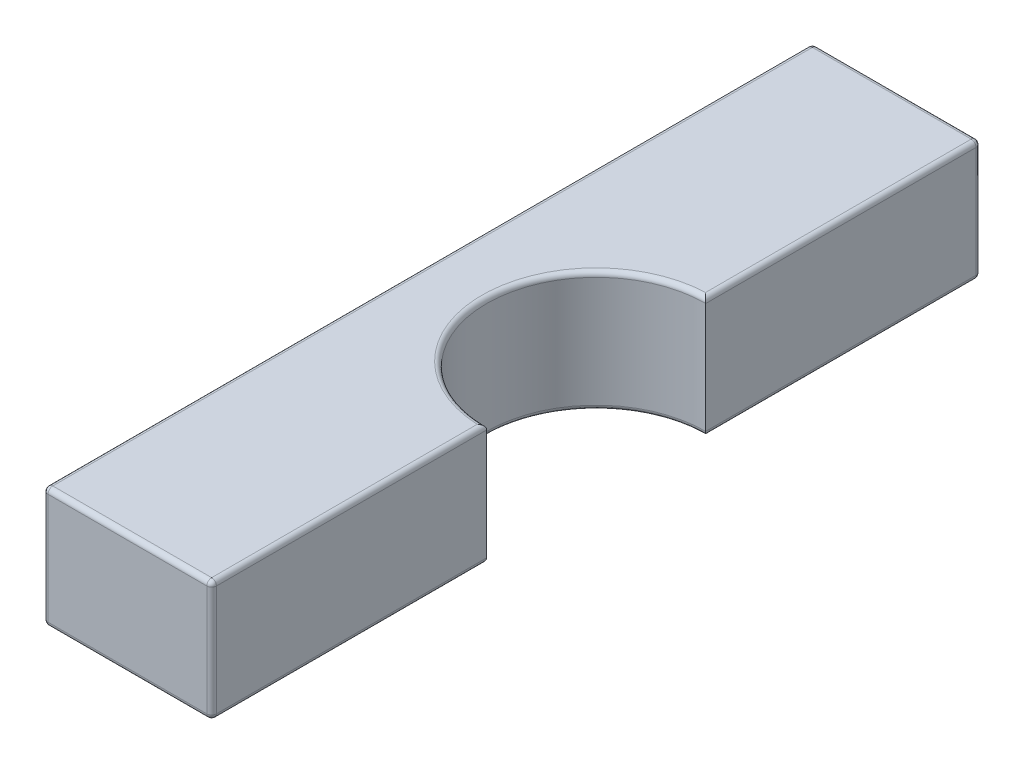
ISO-10303-21;
HEADER;
FILE_DESCRIPTION(('STEP AP214'),'2;1');
FILE_NAME('part.step','',(''),(''),'','','');
FILE_SCHEMA(('AUTOMOTIVE_DESIGN { 1 0 10303 214 1 1 1 1 }'));
ENDSEC;
DATA;
#1=APPLICATION_CONTEXT('core data for automotive mechanical design processes');
#2=APPLICATION_PROTOCOL_DEFINITION('international standard','automotive_design',2000,#1);
#3=PRODUCT_CONTEXT('',#1,'mechanical');
#4=PRODUCT('Part','Part','',(#3));
#5=PRODUCT_RELATED_PRODUCT_CATEGORY('part','',(#4));
#6=PRODUCT_DEFINITION_FORMATION('','',#4);
#7=PRODUCT_DEFINITION_CONTEXT('part definition',#1,'design');
#8=PRODUCT_DEFINITION('design','',#6,#7);
#9=PRODUCT_DEFINITION_SHAPE('','',#8);
#10=(LENGTH_UNIT() NAMED_UNIT(*) SI_UNIT(.MILLI.,.METRE.));
#11=(NAMED_UNIT(*) PLANE_ANGLE_UNIT() SI_UNIT($,.RADIAN.));
#12=(NAMED_UNIT(*) SI_UNIT($,.STERADIAN.) SOLID_ANGLE_UNIT());
#13=UNCERTAINTY_MEASURE_WITH_UNIT(LENGTH_MEASURE(1.E-05),#10,'distance_accuracy_value','');
#14=(GEOMETRIC_REPRESENTATION_CONTEXT(3) GLOBAL_UNCERTAINTY_ASSIGNED_CONTEXT((#13)) GLOBAL_UNIT_ASSIGNED_CONTEXT((#10,
#11,#12)) REPRESENTATION_CONTEXT('',''));
#15=CARTESIAN_POINT('',(0.,0.,0.));
#16=DIRECTION('',(0.,0.,1.));
#17=DIRECTION('',(1.,0.,0.));
#18=AXIS2_PLACEMENT_3D('',#15,#16,#17);
#19=CARTESIAN_POINT('',(1.55,0.25,1.598));
#20=DIRECTION('',(0.,-1.,0.));
#21=DIRECTION('',(0.,0.,-1.));
#22=AXIS2_PLACEMENT_3D('',#19,#20,#21);
#23=PLANE('',#22);
#24=DIRECTION('',(1.,0.,0.));
#25=VECTOR('',#24,1.);
#26=CARTESIAN_POINT('',(1.55,0.25,1.578));
#27=LINE('',#26,#25);
#28=CARTESIAN_POINT('',(1.57,0.25,1.578));
#29=VERTEX_POINT('',#28);
#30=CARTESIAN_POINT('',(2.23,0.25,1.578));
#31=VERTEX_POINT('',#30);
#32=EDGE_CURVE('E11',#29,#31,#27,.T.);
#33=ORIENTED_EDGE('',*,*,#32,.T.);
#34=DIRECTION('',(0.,0.,-1.));
#35=VECTOR('',#34,1.);
#36=CARTESIAN_POINT('',(2.23,0.25,1.598));
#37=LINE('',#36,#35);
#38=CARTESIAN_POINT('',(2.23,0.25,0.474578760586691));
#39=VERTEX_POINT('',#38);
#40=EDGE_CURVE('E24',#31,#39,#37,.T.);
#41=ORIENTED_EDGE('',*,*,#40,.T.);
#42=CARTESIAN_POINT('',(2.25,0.25,0.));
#43=DIRECTION('',(0.,-1.,0.));
#44=DIRECTION('',(0.,0.,-1.));
#45=AXIS2_PLACEMENT_3D('',#42,#43,#44);
#46=CIRCLE('',#45,0.475);
#47=CARTESIAN_POINT('',(2.23,0.25,-0.474578760586691));
#48=VERTEX_POINT('',#47);
#49=EDGE_CURVE('E295',#39,#48,#46,.T.);
#50=ORIENTED_EDGE('',*,*,#49,.T.);
#51=DIRECTION('',(0.,0.,-1.));
#52=VECTOR('',#51,1.);
#53=CARTESIAN_POINT('',(2.23,0.25,1.598));
#54=LINE('',#53,#52);
#55=CARTESIAN_POINT('',(2.23,0.25,-1.578));
#56=VERTEX_POINT('',#55);
#57=EDGE_CURVE('E293',#48,#56,#54,.T.);
#58=ORIENTED_EDGE('',*,*,#57,.T.);
#59=DIRECTION('',(-1.,0.,0.));
#60=VECTOR('',#59,1.);
#61=CARTESIAN_POINT('',(1.55,0.25,-1.578));
#62=LINE('',#61,#60);
#63=CARTESIAN_POINT('',(1.57,0.25,-1.578));
#64=VERTEX_POINT('',#63);
#65=EDGE_CURVE('E153',#56,#64,#62,.T.);
#66=ORIENTED_EDGE('',*,*,#65,.T.);
#67=DIRECTION('',(0.,0.,1.));
#68=VECTOR('',#67,1.);
#69=CARTESIAN_POINT('',(1.57,0.25,1.598));
#70=LINE('',#69,#68);
#71=EDGE_CURVE('E290',#64,#29,#70,.T.);
#72=ORIENTED_EDGE('',*,*,#71,.T.);
#73=EDGE_LOOP('',(#33,#41,#50,#58,#66,#72));
#74=FACE_BOUND('',#73,.T.);
#75=ADVANCED_FACE('F17',(#74),#23,.F.);
#76=CARTESIAN_POINT('',(2.25,-0.25,1.598));
#77=DIRECTION('',(0.,1.,0.));
#78=DIRECTION('',(0.,0.,1.));
#79=AXIS2_PLACEMENT_3D('',#76,#77,#78);
#80=PLANE('',#79);
#81=CARTESIAN_POINT('',(2.25,-0.25,0.));
#82=DIRECTION('',(0.,1.,0.));
#83=DIRECTION('',(0.,0.,1.));
#84=AXIS2_PLACEMENT_3D('',#81,#82,#83);
#85=CIRCLE('',#84,0.475);
#86=CARTESIAN_POINT('',(2.23,-0.25,-0.474578760586691));
#87=VERTEX_POINT('',#86);
#88=CARTESIAN_POINT('',(2.23,-0.25,0.474578760586691));
#89=VERTEX_POINT('',#88);
#90=EDGE_CURVE('E288',#87,#89,#85,.T.);
#91=ORIENTED_EDGE('',*,*,#90,.T.);
#92=DIRECTION('',(0.,0.,1.));
#93=VECTOR('',#92,1.);
#94=CARTESIAN_POINT('',(2.23,-0.25,1.598));
#95=LINE('',#94,#93);
#96=CARTESIAN_POINT('',(2.23,-0.25,1.578));
#97=VERTEX_POINT('',#96);
#98=EDGE_CURVE('E286',#89,#97,#95,.T.);
#99=ORIENTED_EDGE('',*,*,#98,.T.);
#100=DIRECTION('',(-1.,0.,0.));
#101=VECTOR('',#100,1.);
#102=CARTESIAN_POINT('',(2.25,-0.25,1.578));
#103=LINE('',#102,#101);
#104=CARTESIAN_POINT('',(1.57,-0.25,1.578));
#105=VERTEX_POINT('',#104);
#106=EDGE_CURVE('E284',#97,#105,#103,.T.);
#107=ORIENTED_EDGE('',*,*,#106,.T.);
#108=DIRECTION('',(0.,0.,-1.));
#109=VECTOR('',#108,1.);
#110=CARTESIAN_POINT('',(1.57,-0.25,1.598));
#111=LINE('',#110,#109);
#112=CARTESIAN_POINT('',(1.57,-0.25,-1.578));
#113=VERTEX_POINT('',#112);
#114=EDGE_CURVE('E282',#105,#113,#111,.T.);
#115=ORIENTED_EDGE('',*,*,#114,.T.);
#116=DIRECTION('',(1.,0.,0.));
#117=VECTOR('',#116,1.);
#118=CARTESIAN_POINT('',(2.25,-0.25,-1.578));
#119=LINE('',#118,#117);
#120=CARTESIAN_POINT('',(2.23,-0.25,-1.578));
#121=VERTEX_POINT('',#120);
#122=EDGE_CURVE('E280',#113,#121,#119,.T.);
#123=ORIENTED_EDGE('',*,*,#122,.T.);
#124=DIRECTION('',(0.,0.,1.));
#125=VECTOR('',#124,1.);
#126=CARTESIAN_POINT('',(2.23,-0.25,1.598));
#127=LINE('',#126,#125);
#128=EDGE_CURVE('E277',#121,#87,#127,.T.);
#129=ORIENTED_EDGE('',*,*,#128,.T.);
#130=EDGE_LOOP('',(#91,#99,#107,#115,#123,#129));
#131=FACE_BOUND('',#130,.T.);
#132=ADVANCED_FACE('F414',(#131),#80,.F.);
#133=CARTESIAN_POINT('',(2.25,0.25,1.598));
#134=DIRECTION('',(-1.,0.,0.));
#135=DIRECTION('',(0.,0.,1.));
#136=AXIS2_PLACEMENT_3D('',#133,#134,#135);
#137=PLANE('',#136);
#138=DIRECTION('',(0.,1.,0.));
#139=VECTOR('',#138,1.);
#140=CARTESIAN_POINT('',(2.25,1.,-0.455));
#141=LINE('',#140,#139);
#142=CARTESIAN_POINT('',(2.25,-0.23,-0.455));
#143=VERTEX_POINT('',#142);
#144=CARTESIAN_POINT('',(2.25,0.23,-0.455));
#145=VERTEX_POINT('',#144);
#146=EDGE_CURVE('E275',#143,#145,#141,.T.);
#147=ORIENTED_EDGE('',*,*,#146,.F.);
#148=DIRECTION('',(0.,0.,-1.));
#149=VECTOR('',#148,1.);
#150=CARTESIAN_POINT('',(2.25,-0.23,1.598));
#151=LINE('',#150,#149);
#152=CARTESIAN_POINT('',(2.25,-0.23,-1.578));
#153=VERTEX_POINT('',#152);
#154=EDGE_CURVE('E273',#143,#153,#151,.T.);
#155=ORIENTED_EDGE('',*,*,#154,.T.);
#156=DIRECTION('',(0.,1.,0.));
#157=VECTOR('',#156,1.);
#158=CARTESIAN_POINT('',(2.25,0.25,-1.578));
#159=LINE('',#158,#157);
#160=CARTESIAN_POINT('',(2.25,0.23,-1.578));
#161=VERTEX_POINT('',#160);
#162=EDGE_CURVE('E271',#153,#161,#159,.T.);
#163=ORIENTED_EDGE('',*,*,#162,.T.);
#164=DIRECTION('',(0.,0.,1.));
#165=VECTOR('',#164,1.);
#166=CARTESIAN_POINT('',(2.25,0.23,1.598));
#167=LINE('',#166,#165);
#168=EDGE_CURVE('E268',#161,#145,#167,.T.);
#169=ORIENTED_EDGE('',*,*,#168,.T.);
#170=EDGE_LOOP('',(#147,#155,#163,#169));
#171=FACE_BOUND('',#170,.T.);
#172=ADVANCED_FACE('F418',(#171),#137,.F.);
#173=CARTESIAN_POINT('',(2.25,0.25,1.598));
#174=DIRECTION('',(-1.,0.,0.));
#175=DIRECTION('',(0.,0.,1.));
#176=AXIS2_PLACEMENT_3D('',#173,#174,#175);
#177=PLANE('',#176);
#178=DIRECTION('',(0.,-1.,0.));
#179=VECTOR('',#178,1.);
#180=CARTESIAN_POINT('',(2.25,0.25,1.578));
#181=LINE('',#180,#179);
#182=CARTESIAN_POINT('',(2.25,0.23,1.578));
#183=VERTEX_POINT('',#182);
#184=CARTESIAN_POINT('',(2.25,-0.23,1.578));
#185=VERTEX_POINT('',#184);
#186=EDGE_CURVE('E266',#183,#185,#181,.T.);
#187=ORIENTED_EDGE('',*,*,#186,.T.);
#188=DIRECTION('',(0.,0.,-1.));
#189=VECTOR('',#188,1.);
#190=CARTESIAN_POINT('',(2.25,-0.23,1.598));
#191=LINE('',#190,#189);
#192=CARTESIAN_POINT('',(2.25,-0.23,0.455));
#193=VERTEX_POINT('',#192);
#194=EDGE_CURVE('E264',#185,#193,#191,.T.);
#195=ORIENTED_EDGE('',*,*,#194,.T.);
#196=DIRECTION('',(0.,-1.,0.));
#197=VECTOR('',#196,1.);
#198=CARTESIAN_POINT('',(2.25,1.,0.455));
#199=LINE('',#198,#197);
#200=CARTESIAN_POINT('',(2.25,0.23,0.455));
#201=VERTEX_POINT('',#200);
#202=EDGE_CURVE('E261',#201,#193,#199,.T.);
#203=ORIENTED_EDGE('',*,*,#202,.F.);
#204=DIRECTION('',(0.,0.,1.));
#205=VECTOR('',#204,1.);
#206=CARTESIAN_POINT('',(2.25,0.23,1.598));
#207=LINE('',#206,#205);
#208=EDGE_CURVE('E258',#201,#183,#207,.T.);
#209=ORIENTED_EDGE('',*,*,#208,.T.);
#210=EDGE_LOOP('',(#187,#195,#203,#209));
#211=FACE_BOUND('',#210,.T.);
#212=ADVANCED_FACE('F352',(#211),#177,.F.);
#213=CARTESIAN_POINT('',(1.55,-0.25,1.598));
#214=DIRECTION('',(1.,0.,0.));
#215=DIRECTION('',(0.,0.,-1.));
#216=AXIS2_PLACEMENT_3D('',#213,#214,#215);
#217=PLANE('',#216);
#218=DIRECTION('',(0.,-1.,0.));
#219=VECTOR('',#218,1.);
#220=CARTESIAN_POINT('',(1.55,-0.25,-1.578));
#221=LINE('',#220,#219);
#222=CARTESIAN_POINT('',(1.55,0.23,-1.578));
#223=VERTEX_POINT('',#222);
#224=CARTESIAN_POINT('',(1.55,-0.23,-1.578));
#225=VERTEX_POINT('',#224);
#226=EDGE_CURVE('E256',#223,#225,#221,.T.);
#227=ORIENTED_EDGE('',*,*,#226,.T.);
#228=DIRECTION('',(0.,0.,1.));
#229=VECTOR('',#228,1.);
#230=CARTESIAN_POINT('',(1.55,-0.23,1.598));
#231=LINE('',#230,#229);
#232=CARTESIAN_POINT('',(1.55,-0.23,1.578));
#233=VERTEX_POINT('',#232);
#234=EDGE_CURVE('E254',#225,#233,#231,.T.);
#235=ORIENTED_EDGE('',*,*,#234,.T.);
#236=DIRECTION('',(0.,1.,0.));
#237=VECTOR('',#236,1.);
#238=CARTESIAN_POINT('',(1.55,-0.25,1.578));
#239=LINE('',#238,#237);
#240=CARTESIAN_POINT('',(1.55,0.23,1.578));
#241=VERTEX_POINT('',#240);
#242=EDGE_CURVE('E252',#233,#241,#239,.T.);
#243=ORIENTED_EDGE('',*,*,#242,.T.);
#244=DIRECTION('',(0.,0.,-1.));
#245=VECTOR('',#244,1.);
#246=CARTESIAN_POINT('',(1.55,0.23,1.598));
#247=LINE('',#246,#245);
#248=EDGE_CURVE('E249',#241,#223,#247,.T.);
#249=ORIENTED_EDGE('',*,*,#248,.T.);
#250=EDGE_LOOP('',(#227,#235,#243,#249));
#251=FACE_BOUND('',#250,.T.);
#252=ADVANCED_FACE('F331',(#251),#217,.F.);
#253=CARTESIAN_POINT('',(2.25,0.25,1.598));
#254=DIRECTION('',(0.,0.,-1.));
#255=DIRECTION('',(-1.,0.,0.));
#256=AXIS2_PLACEMENT_3D('',#253,#254,#255);
#257=PLANE('',#256);
#258=DIRECTION('',(1.,0.,0.));
#259=VECTOR('',#258,1.);
#260=CARTESIAN_POINT('',(2.25,-0.23,1.598));
#261=LINE('',#260,#259);
#262=CARTESIAN_POINT('',(1.57,-0.23,1.598));
#263=VERTEX_POINT('',#262);
#264=CARTESIAN_POINT('',(2.23,-0.23,1.598));
#265=VERTEX_POINT('',#264);
#266=EDGE_CURVE('E247',#263,#265,#261,.T.);
#267=ORIENTED_EDGE('',*,*,#266,.T.);
#268=DIRECTION('',(0.,1.,0.));
#269=VECTOR('',#268,1.);
#270=CARTESIAN_POINT('',(2.23,0.25,1.598));
#271=LINE('',#270,#269);
#272=CARTESIAN_POINT('',(2.23,0.23,1.598));
#273=VERTEX_POINT('',#272);
#274=EDGE_CURVE('E245',#265,#273,#271,.T.);
#275=ORIENTED_EDGE('',*,*,#274,.T.);
#276=DIRECTION('',(-1.,0.,0.));
#277=VECTOR('',#276,1.);
#278=CARTESIAN_POINT('',(2.25,0.23,1.598));
#279=LINE('',#278,#277);
#280=CARTESIAN_POINT('',(1.57,0.23,1.598));
#281=VERTEX_POINT('',#280);
#282=EDGE_CURVE('E243',#273,#281,#279,.T.);
#283=ORIENTED_EDGE('',*,*,#282,.T.);
#284=DIRECTION('',(0.,-1.,0.));
#285=VECTOR('',#284,1.);
#286=CARTESIAN_POINT('',(1.57,0.25,1.598));
#287=LINE('',#286,#285);
#288=EDGE_CURVE('E240',#281,#263,#287,.T.);
#289=ORIENTED_EDGE('',*,*,#288,.T.);
#290=EDGE_LOOP('',(#267,#275,#283,#289));
#291=FACE_BOUND('',#290,.T.);
#292=ADVANCED_FACE('F403',(#291),#257,.F.);
#293=CARTESIAN_POINT('',(2.25,0.25,-1.598));
#294=DIRECTION('',(0.,0.,-1.));
#295=DIRECTION('',(-1.,0.,0.));
#296=AXIS2_PLACEMENT_3D('',#293,#294,#295);
#297=PLANE('',#296);
#298=DIRECTION('',(-1.,0.,0.));
#299=VECTOR('',#298,1.);
#300=CARTESIAN_POINT('',(1.55,-0.23,-1.598));
#301=LINE('',#300,#299);
#302=CARTESIAN_POINT('',(2.23,-0.23,-1.598));
#303=VERTEX_POINT('',#302);
#304=CARTESIAN_POINT('',(1.57,-0.23,-1.598));
#305=VERTEX_POINT('',#304);
#306=EDGE_CURVE('E238',#303,#305,#301,.T.);
#307=ORIENTED_EDGE('',*,*,#306,.T.);
#308=DIRECTION('',(0.,1.,0.));
#309=VECTOR('',#308,1.);
#310=CARTESIAN_POINT('',(1.57,0.25,-1.598));
#311=LINE('',#310,#309);
#312=CARTESIAN_POINT('',(1.57,0.23,-1.598));
#313=VERTEX_POINT('',#312);
#314=EDGE_CURVE('E132',#305,#313,#311,.T.);
#315=ORIENTED_EDGE('',*,*,#314,.T.);
#316=DIRECTION('',(1.,0.,0.));
#317=VECTOR('',#316,1.);
#318=CARTESIAN_POINT('',(2.25,0.23,-1.598));
#319=LINE('',#318,#317);
#320=CARTESIAN_POINT('',(2.23,0.23,-1.598));
#321=VERTEX_POINT('',#320);
#322=EDGE_CURVE('E126',#313,#321,#319,.T.);
#323=ORIENTED_EDGE('',*,*,#322,.T.);
#324=DIRECTION('',(0.,-1.,0.));
#325=VECTOR('',#324,1.);
#326=CARTESIAN_POINT('',(2.23,-0.25,-1.598));
#327=LINE('',#326,#325);
#328=EDGE_CURVE('E129',#321,#303,#327,.T.);
#329=ORIENTED_EDGE('',*,*,#328,.T.);
#330=EDGE_LOOP('',(#307,#315,#323,#329));
#331=FACE_BOUND('',#330,.T.);
#332=ADVANCED_FACE('F128',(#331),#297,.T.);
#333=CARTESIAN_POINT('',(2.25,1.,0.));
#334=DIRECTION('',(0.,-1.,0.));
#335=DIRECTION('',(0.,0.,-1.));
#336=AXIS2_PLACEMENT_3D('',#333,#334,#335);
#337=CYLINDRICAL_SURFACE('',#336,0.455);
#338=ORIENTED_EDGE('',*,*,#202,.T.);
#339=CARTESIAN_POINT('',(2.25,-0.23,0.));
#340=DIRECTION('',(0.,-1.,0.));
#341=DIRECTION('',(0.,0.,1.));
#342=AXIS2_PLACEMENT_3D('',#339,#340,#341);
#343=CIRCLE('',#342,0.455);
#344=EDGE_CURVE('E147',#193,#143,#343,.T.);
#345=ORIENTED_EDGE('',*,*,#344,.T.);
#346=ORIENTED_EDGE('',*,*,#146,.T.);
#347=CARTESIAN_POINT('',(2.25,0.23,0.));
#348=DIRECTION('',(0.,1.,0.));
#349=DIRECTION('',(0.,0.,-1.));
#350=AXIS2_PLACEMENT_3D('',#347,#348,#349);
#351=CIRCLE('',#350,0.455);
#352=EDGE_CURVE('E232',#145,#201,#351,.T.);
#353=ORIENTED_EDGE('',*,*,#352,.T.);
#354=EDGE_LOOP('',(#338,#345,#346,#353));
#355=FACE_BOUND('',#354,.T.);
#356=ADVANCED_FACE('F310',(#355),#337,.F.);
#357=CARTESIAN_POINT('',(1.57,0.23,1.578));
#358=DIRECTION('',(0.,1.,0.));
#359=DIRECTION('',(1.,0.,0.));
#360=AXIS2_PLACEMENT_3D('',#357,#358,#359);
#361=SPHERICAL_SURFACE('',#360,0.02);
#362=CARTESIAN_POINT('',(1.57,0.23,1.578));
#363=DIRECTION('',(0.,-1.,0.));
#364=DIRECTION('',(0.,0.,1.));
#365=AXIS2_PLACEMENT_3D('',#362,#363,#364);
#366=CIRCLE('',#365,0.0200000000000001);
#367=EDGE_CURVE('E229',#281,#241,#366,.T.);
#368=ORIENTED_EDGE('',*,*,#367,.F.);
#369=CARTESIAN_POINT('',(1.57,0.23,1.578));
#370=DIRECTION('',(1.,0.,0.));
#371=DIRECTION('',(0.,0.,1.));
#372=AXIS2_PLACEMENT_3D('',#369,#370,#371);
#373=CIRCLE('',#372,0.0200000000000001);
#374=EDGE_CURVE('E227',#29,#281,#373,.T.);
#375=ORIENTED_EDGE('',*,*,#374,.F.);
#376=CARTESIAN_POINT('',(1.57,0.23,1.578));
#377=DIRECTION('',(0.,0.,-1.));
#378=DIRECTION('',(1.,0.,0.));
#379=AXIS2_PLACEMENT_3D('',#376,#377,#378);
#380=CIRCLE('',#379,0.0200000000000001);
#381=EDGE_CURVE('E224',#241,#29,#380,.T.);
#382=ORIENTED_EDGE('',*,*,#381,.F.);
#383=EDGE_LOOP('',(#368,#375,#382));
#384=FACE_BOUND('',#383,.T.);
#385=ADVANCED_FACE('F339',(#384),#361,.T.);
#386=CARTESIAN_POINT('',(2.25,0.23,1.578));
#387=DIRECTION('',(-1.,0.,0.));
#388=DIRECTION('',(0.,0.,1.));
#389=AXIS2_PLACEMENT_3D('',#386,#387,#388);
#390=CYLINDRICAL_SURFACE('',#389,0.0200000000000001);
#391=ORIENTED_EDGE('',*,*,#374,.T.);
#392=ORIENTED_EDGE('',*,*,#282,.F.);
#393=CARTESIAN_POINT('',(2.23,0.23,1.578));
#394=DIRECTION('',(1.,0.,0.));
#395=DIRECTION('',(0.,0.,-1.));
#396=AXIS2_PLACEMENT_3D('',#393,#394,#395);
#397=CIRCLE('',#396,0.0200000000000001);
#398=EDGE_CURVE('E218',#31,#273,#397,.T.);
#399=ORIENTED_EDGE('',*,*,#398,.F.);
#400=ORIENTED_EDGE('',*,*,#32,.F.);
#401=EDGE_LOOP('',(#391,#392,#399,#400));
#402=FACE_BOUND('',#401,.T.);
#403=ADVANCED_FACE('F341',(#402),#390,.T.);
#404=CARTESIAN_POINT('',(2.23,0.23,1.598));
#405=DIRECTION('',(0.,0.,-1.));
#406=DIRECTION('',(-1.,0.,0.));
#407=AXIS2_PLACEMENT_3D('',#404,#405,#406);
#408=CYLINDRICAL_SURFACE('',#407,0.0200000000000001);
#409=CARTESIAN_POINT('',(2.23,0.25,0.474578760586691));
#410=CARTESIAN_POINT('',(2.23021525393263,0.25,0.474372252404169));
#411=CARTESIAN_POINT('',(2.23043059007006,0.249996522900328,0.474165800682688));
#412=CARTESIAN_POINT('',(2.23064571796655,0.249989573680195,0.473959278089608));
#413=CARTESIAN_POINT('',(2.2326577939499,0.249924578116342,0.472027686899777));
#414=CARTESIAN_POINT('',(2.23467183566132,0.249555088741646,0.470082105311373));
#415=CARTESIAN_POINT('',(2.2366123111494,0.248875310372343,0.46819632299109));
#416=CARTESIAN_POINT('',(2.23901266247383,0.248034430433848,0.465863626640187));
#417=CARTESIAN_POINT('',(2.24135665352147,0.246696998859956,0.463567246667915));
#418=CARTESIAN_POINT('',(2.2434222737742,0.244827088951374,0.461530855810917));
#419=CARTESIAN_POINT('',(2.2449214134972,0.243469987509958,0.460052929545788));
#420=CARTESIAN_POINT('',(2.24630737480058,0.241795428675963,0.458679081418805));
#421=CARTESIAN_POINT('',(2.24741397458486,0.23983633514903,0.457578717957634));
#422=CARTESIAN_POINT('',(2.24819594569048,0.238451955219616,0.456801153706737));
#423=CARTESIAN_POINT('',(2.24885173877697,0.236895193299772,0.456147036120872));
#424=CARTESIAN_POINT('',(2.24930058699812,0.235242837168284,0.455698876269529));
#425=CARTESIAN_POINT('',(2.2497515921284,0.23358254075356,0.455248562816982));
#426=CARTESIAN_POINT('',(2.25,0.231778418403477,0.455));
#427=CARTESIAN_POINT('',(2.25,0.23,0.455));
#428=B_SPLINE_CURVE_WITH_KNOTS('',3,(#409,#410,#411,#412,#413,#414,#415,#416,#417,#418,#419,
#420,#421,#422,#423,#424,#425,#426,#427),.UNSPECIFIED.,.F.,.F.,(4,3,3,3,3,3,4),
(-8.94884889060006E-07,0.,8.36979500324867E-06,1.87833959963527E-05,2.63200021452557E-05,
3.16247262913835E-05,3.6974326218968E-05),.UNSPECIFIED.);
#429=EDGE_CURVE('E213',#39,#201,#428,.T.);
#430=ORIENTED_EDGE('',*,*,#429,.F.);
#431=ORIENTED_EDGE('',*,*,#40,.F.);
#432=CARTESIAN_POINT('',(2.23,0.23,1.578));
#433=DIRECTION('',(0.,0.,1.));
#434=DIRECTION('',(1.,0.,0.));
#435=AXIS2_PLACEMENT_3D('',#432,#433,#434);
#436=CIRCLE('',#435,0.0200000000000001);
#437=EDGE_CURVE('E210',#183,#31,#436,.T.);
#438=ORIENTED_EDGE('',*,*,#437,.F.);
#439=ORIENTED_EDGE('',*,*,#208,.F.);
#440=EDGE_LOOP('',(#430,#431,#438,#439));
#441=FACE_BOUND('',#440,.T.);
#442=ADVANCED_FACE('F306',(#441),#408,.T.);
#443=CARTESIAN_POINT('',(1.57,0.23,1.598));
#444=DIRECTION('',(0.,0.,-1.));
#445=DIRECTION('',(-1.,0.,0.));
#446=AXIS2_PLACEMENT_3D('',#443,#444,#445);
#447=CYLINDRICAL_SURFACE('',#446,0.0200000000000001);
#448=ORIENTED_EDGE('',*,*,#381,.T.);
#449=ORIENTED_EDGE('',*,*,#71,.F.);
#450=CARTESIAN_POINT('',(1.57,0.23,-1.578));
#451=DIRECTION('',(0.,0.,-1.));
#452=DIRECTION('',(-1.,0.,0.));
#453=AXIS2_PLACEMENT_3D('',#450,#451,#452);
#454=CIRCLE('',#453,0.0200000000000001);
#455=EDGE_CURVE('E207',#223,#64,#454,.T.);
#456=ORIENTED_EDGE('',*,*,#455,.F.);
#457=ORIENTED_EDGE('',*,*,#248,.F.);
#458=EDGE_LOOP('',(#448,#449,#456,#457));
#459=FACE_BOUND('',#458,.T.);
#460=ADVANCED_FACE('F319',(#459),#447,.T.);
#461=CARTESIAN_POINT('',(1.57,0.25,1.578));
#462=DIRECTION('',(0.,-1.,0.));
#463=DIRECTION('',(0.,0.,-1.));
#464=AXIS2_PLACEMENT_3D('',#461,#462,#463);
#465=CYLINDRICAL_SURFACE('',#464,0.0200000000000001);
#466=ORIENTED_EDGE('',*,*,#367,.T.);
#467=ORIENTED_EDGE('',*,*,#242,.F.);
#468=CARTESIAN_POINT('',(1.57,-0.23,1.578));
#469=DIRECTION('',(0.,-1.,0.));
#470=DIRECTION('',(0.,0.,-1.));
#471=AXIS2_PLACEMENT_3D('',#468,#469,#470);
#472=CIRCLE('',#471,0.0200000000000001);
#473=EDGE_CURVE('E204',#263,#233,#472,.T.);
#474=ORIENTED_EDGE('',*,*,#473,.F.);
#475=ORIENTED_EDGE('',*,*,#288,.F.);
#476=EDGE_LOOP('',(#466,#467,#474,#475));
#477=FACE_BOUND('',#476,.T.);
#478=ADVANCED_FACE('F336',(#477),#465,.T.);
#479=CARTESIAN_POINT('',(2.23,0.23,1.578));
#480=DIRECTION('',(0.,1.,0.));
#481=DIRECTION('',(1.,0.,0.));
#482=AXIS2_PLACEMENT_3D('',#479,#480,#481);
#483=SPHERICAL_SURFACE('',#482,0.02);
#484=ORIENTED_EDGE('',*,*,#437,.T.);
#485=ORIENTED_EDGE('',*,*,#398,.T.);
#486=CARTESIAN_POINT('',(2.23,0.23,1.578));
#487=DIRECTION('',(0.,-1.,0.));
#488=DIRECTION('',(0.,0.,1.));
#489=AXIS2_PLACEMENT_3D('',#486,#487,#488);
#490=CIRCLE('',#489,0.0200000000000001);
#491=EDGE_CURVE('E198',#183,#273,#490,.T.);
#492=ORIENTED_EDGE('',*,*,#491,.F.);
#493=EDGE_LOOP('',(#484,#485,#492));
#494=FACE_BOUND('',#493,.T.);
#495=ADVANCED_FACE('F344',(#494),#483,.T.);
#496=CARTESIAN_POINT('',(2.25,0.23,0.));
#497=DIRECTION('',(0.,-1.,0.));
#498=DIRECTION('',(0.,0.,-1.));
#499=AXIS2_PLACEMENT_3D('',#496,#497,#498);
#500=TOROIDAL_SURFACE('',#499,0.475,0.02);
#501=ORIENTED_EDGE('',*,*,#429,.T.);
#502=ORIENTED_EDGE('',*,*,#352,.F.);
#503=CARTESIAN_POINT('',(2.23,0.25,-0.474578760586691));
#504=CARTESIAN_POINT('',(2.23021525393263,0.25,-0.474372252404169));
#505=CARTESIAN_POINT('',(2.23043059007006,0.249996522900328,-0.474165800682688));
#506=CARTESIAN_POINT('',(2.23064571796655,0.249989573680195,-0.473959278089608));
#507=CARTESIAN_POINT('',(2.2326577939499,0.249924578116342,-0.472027686899777));
#508=CARTESIAN_POINT('',(2.23467183566132,0.249555088741646,-0.470082105311373));
#509=CARTESIAN_POINT('',(2.2366123111494,0.248875310372343,-0.46819632299109));
#510=CARTESIAN_POINT('',(2.23901266247383,0.248034430433848,-0.465863626640187));
#511=CARTESIAN_POINT('',(2.24135665352147,0.246696998859956,-0.463567246667915));
#512=CARTESIAN_POINT('',(2.2434222737742,0.244827088951374,-0.461530855810917));
#513=CARTESIAN_POINT('',(2.2449214134972,0.243469987509958,-0.460052929545788));
#514=CARTESIAN_POINT('',(2.24630737480058,0.241795428675963,-0.458679081418805));
#515=CARTESIAN_POINT('',(2.24741397458486,0.23983633514903,-0.457578717957634));
#516=CARTESIAN_POINT('',(2.24819594569048,0.238451955219616,-0.456801153706737));
#517=CARTESIAN_POINT('',(2.24885173877697,0.236895193299772,-0.456147036120872));
#518=CARTESIAN_POINT('',(2.24930058699812,0.235242837168284,-0.455698876269529));
#519=CARTESIAN_POINT('',(2.2497515921284,0.23358254075356,-0.455248562816982));
#520=CARTESIAN_POINT('',(2.25,0.231778418403477,-0.455));
#521=CARTESIAN_POINT('',(2.25,0.23,-0.455));
#522=B_SPLINE_CURVE_WITH_KNOTS('',3,(#503,#504,#505,#506,#507,#508,#509,#510,#511,#512,#513,
#514,#515,#516,#517,#518,#519,#520,#521),.UNSPECIFIED.,.F.,.F.,(4,3,3,3,3,3,4),
(-8.94884889060006E-07,0.,8.36979500324867E-06,1.87833959963527E-05,2.63200021452557E-05,
3.16247262913835E-05,3.6974326218968E-05),.UNSPECIFIED.);
#523=EDGE_CURVE('E193',#48,#145,#522,.T.);
#524=ORIENTED_EDGE('',*,*,#523,.F.);
#525=ORIENTED_EDGE('',*,*,#49,.F.);
#526=EDGE_LOOP('',(#501,#502,#524,#525));
#527=FACE_BOUND('',#526,.T.);
#528=ADVANCED_FACE('F303',(#527),#500,.T.);
#529=CARTESIAN_POINT('',(1.57,0.23,-1.578));
#530=DIRECTION('',(0.,1.,0.));
#531=DIRECTION('',(1.,0.,0.));
#532=AXIS2_PLACEMENT_3D('',#529,#530,#531);
#533=SPHERICAL_SURFACE('',#532,0.02);
#534=CARTESIAN_POINT('',(1.57,0.23,-1.578));
#535=DIRECTION('',(0.,-1.,0.));
#536=DIRECTION('',(0.,0.,1.));
#537=AXIS2_PLACEMENT_3D('',#534,#535,#536);
#538=CIRCLE('',#537,0.0200000000000001);
#539=EDGE_CURVE('E191',#223,#313,#538,.T.);
#540=ORIENTED_EDGE('',*,*,#539,.F.);
#541=ORIENTED_EDGE('',*,*,#455,.T.);
#542=CARTESIAN_POINT('',(1.57,0.23,-1.578));
#543=DIRECTION('',(1.,0.,0.));
#544=DIRECTION('',(0.,0.,1.));
#545=AXIS2_PLACEMENT_3D('',#542,#543,#544);
#546=CIRCLE('',#545,0.0200000000000001);
#547=EDGE_CURVE('E189',#313,#64,#546,.T.);
#548=ORIENTED_EDGE('',*,*,#547,.F.);
#549=EDGE_LOOP('',(#540,#541,#548));
#550=FACE_BOUND('',#549,.T.);
#551=ADVANCED_FACE('F325',(#550),#533,.T.);
#552=CARTESIAN_POINT('',(1.57,-0.23,1.578));
#553=DIRECTION('',(0.,1.,0.));
#554=DIRECTION('',(1.,0.,0.));
#555=AXIS2_PLACEMENT_3D('',#552,#553,#554);
#556=SPHERICAL_SURFACE('',#555,0.02);
#557=CARTESIAN_POINT('',(1.57,-0.23,1.578));
#558=DIRECTION('',(0.,0.,-1.));
#559=DIRECTION('',(1.,0.,0.));
#560=AXIS2_PLACEMENT_3D('',#557,#558,#559);
#561=CIRCLE('',#560,0.0200000000000001);
#562=EDGE_CURVE('E186',#105,#233,#561,.T.);
#563=ORIENTED_EDGE('',*,*,#562,.F.);
#564=CARTESIAN_POINT('',(1.57,-0.23,1.578));
#565=DIRECTION('',(1.,0.,0.));
#566=DIRECTION('',(0.,0.,1.));
#567=AXIS2_PLACEMENT_3D('',#564,#565,#566);
#568=CIRCLE('',#567,0.0200000000000001);
#569=EDGE_CURVE('E183',#263,#105,#568,.T.);
#570=ORIENTED_EDGE('',*,*,#569,.F.);
#571=ORIENTED_EDGE('',*,*,#473,.T.);
#572=EDGE_LOOP('',(#563,#570,#571));
#573=FACE_BOUND('',#572,.T.);
#574=ADVANCED_FACE('F399',(#573),#556,.T.);
#575=CARTESIAN_POINT('',(2.25,-0.23,1.578));
#576=DIRECTION('',(1.,0.,0.));
#577=DIRECTION('',(0.,0.,-1.));
#578=AXIS2_PLACEMENT_3D('',#575,#576,#577);
#579=CYLINDRICAL_SURFACE('',#578,0.0200000000000001);
#580=ORIENTED_EDGE('',*,*,#569,.T.);
#581=ORIENTED_EDGE('',*,*,#106,.F.);
#582=CARTESIAN_POINT('',(2.23,-0.23,1.578));
#583=DIRECTION('',(1.,0.,0.));
#584=DIRECTION('',(0.,0.,-1.));
#585=AXIS2_PLACEMENT_3D('',#582,#583,#584);
#586=CIRCLE('',#585,0.0200000000000001);
#587=EDGE_CURVE('E180',#265,#97,#586,.T.);
#588=ORIENTED_EDGE('',*,*,#587,.F.);
#589=ORIENTED_EDGE('',*,*,#266,.F.);
#590=EDGE_LOOP('',(#580,#581,#588,#589));
#591=FACE_BOUND('',#590,.T.);
#592=ADVANCED_FACE('F402',(#591),#579,.T.);
#593=CARTESIAN_POINT('',(2.23,0.25,1.578));
#594=DIRECTION('',(0.,1.,0.));
#595=DIRECTION('',(0.,0.,1.));
#596=AXIS2_PLACEMENT_3D('',#593,#594,#595);
#597=CYLINDRICAL_SURFACE('',#596,0.0200000000000001);
#598=ORIENTED_EDGE('',*,*,#491,.T.);
#599=ORIENTED_EDGE('',*,*,#274,.F.);
#600=CARTESIAN_POINT('',(2.23,-0.23,1.578));
#601=DIRECTION('',(0.,-1.,0.));
#602=DIRECTION('',(0.,0.,-1.));
#603=AXIS2_PLACEMENT_3D('',#600,#601,#602);
#604=CIRCLE('',#603,0.0200000000000001);
#605=EDGE_CURVE('E177',#185,#265,#604,.T.);
#606=ORIENTED_EDGE('',*,*,#605,.F.);
#607=ORIENTED_EDGE('',*,*,#186,.F.);
#608=EDGE_LOOP('',(#598,#599,#606,#607));
#609=FACE_BOUND('',#608,.T.);
#610=ADVANCED_FACE('F347',(#609),#597,.T.);
#611=CARTESIAN_POINT('',(2.23,0.23,1.598));
#612=DIRECTION('',(0.,0.,-1.));
#613=DIRECTION('',(-1.,0.,0.));
#614=AXIS2_PLACEMENT_3D('',#611,#612,#613);
#615=CYLINDRICAL_SURFACE('',#614,0.0200000000000001);
#616=ORIENTED_EDGE('',*,*,#523,.T.);
#617=ORIENTED_EDGE('',*,*,#168,.F.);
#618=CARTESIAN_POINT('',(2.23,0.23,-1.578));
#619=DIRECTION('',(0.,0.,-1.));
#620=DIRECTION('',(-1.,0.,0.));
#621=AXIS2_PLACEMENT_3D('',#618,#619,#620);
#622=CIRCLE('',#621,0.0200000000000001);
#623=EDGE_CURVE('E157',#56,#161,#622,.T.);
#624=ORIENTED_EDGE('',*,*,#623,.F.);
#625=ORIENTED_EDGE('',*,*,#57,.F.);
#626=EDGE_LOOP('',(#616,#617,#624,#625));
#627=FACE_BOUND('',#626,.T.);
#628=ADVANCED_FACE('F314',(#627),#615,.T.);
#629=CARTESIAN_POINT('',(1.55,0.23,-1.578));
#630=DIRECTION('',(1.,0.,0.));
#631=DIRECTION('',(0.,0.,-1.));
#632=AXIS2_PLACEMENT_3D('',#629,#630,#631);
#633=CYLINDRICAL_SURFACE('',#632,0.0200000000000001);
#634=ORIENTED_EDGE('',*,*,#547,.T.);
#635=ORIENTED_EDGE('',*,*,#65,.F.);
#636=CARTESIAN_POINT('',(2.23,0.23,-1.578));
#637=DIRECTION('',(1.,0.,0.));
#638=DIRECTION('',(0.,0.,-1.));
#639=AXIS2_PLACEMENT_3D('',#636,#637,#638);
#640=CIRCLE('',#639,0.0200000000000001);
#641=EDGE_CURVE('E151',#321,#56,#640,.T.);
#642=ORIENTED_EDGE('',*,*,#641,.F.);
#643=ORIENTED_EDGE('',*,*,#322,.F.);
#644=EDGE_LOOP('',(#634,#635,#642,#643));
#645=FACE_BOUND('',#644,.T.);
#646=ADVANCED_FACE('F152',(#645),#633,.T.);
#647=CARTESIAN_POINT('',(1.57,-0.25,-1.578));
#648=DIRECTION('',(0.,1.,0.));
#649=DIRECTION('',(0.,0.,1.));
#650=AXIS2_PLACEMENT_3D('',#647,#648,#649);
#651=CYLINDRICAL_SURFACE('',#650,0.0200000000000001);
#652=ORIENTED_EDGE('',*,*,#539,.T.);
#653=ORIENTED_EDGE('',*,*,#314,.F.);
#654=CARTESIAN_POINT('',(1.57,-0.23,-1.578));
#655=DIRECTION('',(0.,-1.,0.));
#656=DIRECTION('',(0.,0.,-1.));
#657=AXIS2_PLACEMENT_3D('',#654,#655,#656);
#658=CIRCLE('',#657,0.0200000000000001);
#659=EDGE_CURVE('E158',#225,#305,#658,.T.);
#660=ORIENTED_EDGE('',*,*,#659,.F.);
#661=ORIENTED_EDGE('',*,*,#226,.F.);
#662=EDGE_LOOP('',(#652,#653,#660,#661));
#663=FACE_BOUND('',#662,.T.);
#664=ADVANCED_FACE('F327',(#663),#651,.T.);
#665=CARTESIAN_POINT('',(1.57,-0.23,1.598));
#666=DIRECTION('',(0.,0.,-1.));
#667=DIRECTION('',(-1.,0.,0.));
#668=AXIS2_PLACEMENT_3D('',#665,#666,#667);
#669=CYLINDRICAL_SURFACE('',#668,0.0200000000000001);
#670=ORIENTED_EDGE('',*,*,#562,.T.);
#671=ORIENTED_EDGE('',*,*,#234,.F.);
#672=CARTESIAN_POINT('',(1.57,-0.23,-1.578));
#673=DIRECTION('',(0.,0.,-1.));
#674=DIRECTION('',(-1.,0.,0.));
#675=AXIS2_PLACEMENT_3D('',#672,#673,#674);
#676=CIRCLE('',#675,0.0200000000000001);
#677=EDGE_CURVE('E165',#113,#225,#676,.T.);
#678=ORIENTED_EDGE('',*,*,#677,.F.);
#679=ORIENTED_EDGE('',*,*,#114,.F.);
#680=EDGE_LOOP('',(#670,#671,#678,#679));
#681=FACE_BOUND('',#680,.T.);
#682=ADVANCED_FACE('F395',(#681),#669,.T.);
#683=CARTESIAN_POINT('',(2.23,-0.23,1.578));
#684=DIRECTION('',(0.,1.,0.));
#685=DIRECTION('',(1.,0.,0.));
#686=AXIS2_PLACEMENT_3D('',#683,#684,#685);
#687=SPHERICAL_SURFACE('',#686,0.02);
#688=ORIENTED_EDGE('',*,*,#605,.T.);
#689=ORIENTED_EDGE('',*,*,#587,.T.);
#690=CARTESIAN_POINT('',(2.23,-0.23,1.578));
#691=DIRECTION('',(0.,0.,-1.));
#692=DIRECTION('',(1.,0.,0.));
#693=AXIS2_PLACEMENT_3D('',#690,#691,#692);
#694=CIRCLE('',#693,0.0200000000000001);
#695=EDGE_CURVE('E161',#185,#97,#694,.T.);
#696=ORIENTED_EDGE('',*,*,#695,.F.);
#697=EDGE_LOOP('',(#688,#689,#696));
#698=FACE_BOUND('',#697,.T.);
#699=ADVANCED_FACE('F579',(#698),#687,.T.);
#700=CARTESIAN_POINT('',(2.23,0.23,-1.578));
#701=DIRECTION('',(0.,1.,0.));
#702=DIRECTION('',(1.,0.,0.));
#703=AXIS2_PLACEMENT_3D('',#700,#701,#702);
#704=SPHERICAL_SURFACE('',#703,0.02);
#705=ORIENTED_EDGE('',*,*,#641,.T.);
#706=ORIENTED_EDGE('',*,*,#623,.T.);
#707=CARTESIAN_POINT('',(2.23,0.23,-1.578));
#708=DIRECTION('',(0.,-1.,0.));
#709=DIRECTION('',(0.,0.,1.));
#710=AXIS2_PLACEMENT_3D('',#707,#708,#709);
#711=CIRCLE('',#710,0.0200000000000001);
#712=EDGE_CURVE('E143',#321,#161,#711,.T.);
#713=ORIENTED_EDGE('',*,*,#712,.F.);
#714=EDGE_LOOP('',(#705,#706,#713));
#715=FACE_BOUND('',#714,.T.);
#716=ADVANCED_FACE('F160',(#715),#704,.T.);
#717=CARTESIAN_POINT('',(1.57,-0.23,-1.578));
#718=DIRECTION('',(0.,1.,0.));
#719=DIRECTION('',(1.,0.,0.));
#720=AXIS2_PLACEMENT_3D('',#717,#718,#719);
#721=SPHERICAL_SURFACE('',#720,0.02);
#722=ORIENTED_EDGE('',*,*,#677,.T.);
#723=ORIENTED_EDGE('',*,*,#659,.T.);
#724=CARTESIAN_POINT('',(1.57,-0.23,-1.578));
#725=DIRECTION('',(1.,0.,0.));
#726=DIRECTION('',(0.,0.,1.));
#727=AXIS2_PLACEMENT_3D('',#724,#725,#726);
#728=CIRCLE('',#727,0.0200000000000001);
#729=EDGE_CURVE('E162',#113,#305,#728,.T.);
#730=ORIENTED_EDGE('',*,*,#729,.F.);
#731=EDGE_LOOP('',(#722,#723,#730));
#732=FACE_BOUND('',#731,.T.);
#733=ADVANCED_FACE('F392',(#732),#721,.T.);
#734=CARTESIAN_POINT('',(2.23,-0.23,1.598));
#735=DIRECTION('',(0.,0.,-1.));
#736=DIRECTION('',(-1.,0.,0.));
#737=AXIS2_PLACEMENT_3D('',#734,#735,#736);
#738=CYLINDRICAL_SURFACE('',#737,0.0200000000000001);
#739=ORIENTED_EDGE('',*,*,#695,.T.);
#740=ORIENTED_EDGE('',*,*,#98,.F.);
#741=CARTESIAN_POINT('',(2.25,-0.23,0.455));
#742=CARTESIAN_POINT('',(2.25,-0.231778418403477,0.455));
#743=CARTESIAN_POINT('',(2.2497515921284,-0.23358254075356,0.455248562816982));
#744=CARTESIAN_POINT('',(2.24930058699812,-0.235242837168284,0.455698876269529));
#745=CARTESIAN_POINT('',(2.24885173877697,-0.236895193299772,0.456147036120872));
#746=CARTESIAN_POINT('',(2.24819594569048,-0.238451955219616,0.456801153706737));
#747=CARTESIAN_POINT('',(2.24741397458486,-0.23983633514903,0.457578717957634));
#748=CARTESIAN_POINT('',(2.24630737480058,-0.241795428675963,0.458679081418805));
#749=CARTESIAN_POINT('',(2.2449214134972,-0.243469987509958,0.460052929545788));
#750=CARTESIAN_POINT('',(2.2434222737742,-0.244827088951374,0.461530855810917));
#751=CARTESIAN_POINT('',(2.24135665352147,-0.246696998859956,0.463567246667915));
#752=CARTESIAN_POINT('',(2.23901266247383,-0.248034430433848,0.465863626640187));
#753=CARTESIAN_POINT('',(2.2366123111494,-0.248875310372343,0.46819632299109));
#754=CARTESIAN_POINT('',(2.23467183566132,-0.249555088741646,0.470082105311373));
#755=CARTESIAN_POINT('',(2.2326577939499,-0.249924578116342,0.472027686899777));
#756=CARTESIAN_POINT('',(2.23064571796655,-0.249989573680195,0.473959278089608));
#757=CARTESIAN_POINT('',(2.23043059007006,-0.249996522900328,0.474165800682688));
#758=CARTESIAN_POINT('',(2.23021525393263,-0.25,0.474372252404169));
#759=CARTESIAN_POINT('',(2.23,-0.25,0.474578760586691));
#760=B_SPLINE_CURVE_WITH_KNOTS('',3,(#741,#742,#743,#744,#745,#746,#747,#748,#749,#750,#751,
#752,#753,#754,#755,#756,#757,#758,#759),.UNSPECIFIED.,.F.,.F.,(4,3,3,3,3,3,4),(0.,
5.33525521043196E-06,1.06257549718434E-05,1.81421520425051E-05,2.85278294221039E-05,
3.68751811878074E-05,3.77700660768674E-05),.UNSPECIFIED.);
#761=EDGE_CURVE('E168',#193,#89,#760,.T.);
#762=ORIENTED_EDGE('',*,*,#761,.F.);
#763=ORIENTED_EDGE('',*,*,#194,.F.);
#764=EDGE_LOOP('',(#739,#740,#762,#763));
#765=FACE_BOUND('',#764,.T.);
#766=ADVANCED_FACE('F355',(#765),#738,.T.);
#767=CARTESIAN_POINT('',(2.23,0.25,-1.578));
#768=DIRECTION('',(0.,-1.,0.));
#769=DIRECTION('',(0.,0.,-1.));
#770=AXIS2_PLACEMENT_3D('',#767,#768,#769);
#771=CYLINDRICAL_SURFACE('',#770,0.0200000000000001);
#772=ORIENTED_EDGE('',*,*,#712,.T.);
#773=ORIENTED_EDGE('',*,*,#162,.F.);
#774=CARTESIAN_POINT('',(2.23,-0.23,-1.578));
#775=DIRECTION('',(0.,-1.,0.));
#776=DIRECTION('',(0.,0.,-1.));
#777=AXIS2_PLACEMENT_3D('',#774,#775,#776);
#778=CIRCLE('',#777,0.0200000000000001);
#779=EDGE_CURVE('E145',#303,#153,#778,.T.);
#780=ORIENTED_EDGE('',*,*,#779,.F.);
#781=ORIENTED_EDGE('',*,*,#328,.F.);
#782=EDGE_LOOP('',(#772,#773,#780,#781));
#783=FACE_BOUND('',#782,.T.);
#784=ADVANCED_FACE('F140',(#783),#771,.T.);
#785=CARTESIAN_POINT('',(2.25,-0.23,-1.578));
#786=DIRECTION('',(-1.,0.,0.));
#787=DIRECTION('',(0.,0.,1.));
#788=AXIS2_PLACEMENT_3D('',#785,#786,#787);
#789=CYLINDRICAL_SURFACE('',#788,0.0200000000000001);
#790=ORIENTED_EDGE('',*,*,#729,.T.);
#791=ORIENTED_EDGE('',*,*,#306,.F.);
#792=CARTESIAN_POINT('',(2.23,-0.23,-1.578));
#793=DIRECTION('',(1.,0.,0.));
#794=DIRECTION('',(0.,0.,-1.));
#795=AXIS2_PLACEMENT_3D('',#792,#793,#794);
#796=CIRCLE('',#795,0.0200000000000001);
#797=EDGE_CURVE('E359',#121,#303,#796,.T.);
#798=ORIENTED_EDGE('',*,*,#797,.F.);
#799=ORIENTED_EDGE('',*,*,#122,.F.);
#800=EDGE_LOOP('',(#790,#791,#798,#799));
#801=FACE_BOUND('',#800,.T.);
#802=ADVANCED_FACE('F388',(#801),#789,.T.);
#803=CARTESIAN_POINT('',(2.25,-0.23,0.));
#804=DIRECTION('',(0.,1.,0.));
#805=DIRECTION('',(0.,0.,1.));
#806=AXIS2_PLACEMENT_3D('',#803,#804,#805);
#807=TOROIDAL_SURFACE('',#806,0.475,0.02);
#808=ORIENTED_EDGE('',*,*,#761,.T.);
#809=ORIENTED_EDGE('',*,*,#90,.F.);
#810=CARTESIAN_POINT('',(2.25,-0.23,-0.455));
#811=CARTESIAN_POINT('',(2.25,-0.231778418403477,-0.455));
#812=CARTESIAN_POINT('',(2.2497515921284,-0.23358254075356,-0.455248562816982));
#813=CARTESIAN_POINT('',(2.24930058699812,-0.235242837168284,-0.455698876269529));
#814=CARTESIAN_POINT('',(2.24885173877697,-0.236895193299772,-0.456147036120872));
#815=CARTESIAN_POINT('',(2.24819594569048,-0.238451955219616,-0.456801153706737));
#816=CARTESIAN_POINT('',(2.24741397458486,-0.23983633514903,-0.457578717957634));
#817=CARTESIAN_POINT('',(2.24630737480058,-0.241795428675963,-0.458679081418805));
#818=CARTESIAN_POINT('',(2.2449214134972,-0.243469987509958,-0.460052929545788));
#819=CARTESIAN_POINT('',(2.2434222737742,-0.244827088951374,-0.461530855810917));
#820=CARTESIAN_POINT('',(2.24135665352147,-0.246696998859956,-0.463567246667915));
#821=CARTESIAN_POINT('',(2.23901266247383,-0.248034430433848,-0.465863626640187));
#822=CARTESIAN_POINT('',(2.2366123111494,-0.248875310372343,-0.46819632299109));
#823=CARTESIAN_POINT('',(2.23467183566132,-0.249555088741646,-0.470082105311373));
#824=CARTESIAN_POINT('',(2.2326577939499,-0.249924578116342,-0.472027686899777));
#825=CARTESIAN_POINT('',(2.23064571796655,-0.249989573680195,-0.473959278089608));
#826=CARTESIAN_POINT('',(2.23043059007006,-0.249996522900328,-0.474165800682688));
#827=CARTESIAN_POINT('',(2.23021525393263,-0.25,-0.474372252404169));
#828=CARTESIAN_POINT('',(2.23,-0.25,-0.474578760586691));
#829=B_SPLINE_CURVE_WITH_KNOTS('',3,(#810,#811,#812,#813,#814,#815,#816,#817,#818,#819,#820,
#821,#822,#823,#824,#825,#826,#827,#828),.UNSPECIFIED.,.F.,.F.,(4,3,3,3,3,3,4),(0.,
5.33525521043196E-06,1.06257549718434E-05,1.81421520425051E-05,2.85278294221039E-05,
3.68751811878074E-05,3.77700660768674E-05),.UNSPECIFIED.);
#830=EDGE_CURVE('E368',#143,#87,#829,.T.);
#831=ORIENTED_EDGE('',*,*,#830,.F.);
#832=ORIENTED_EDGE('',*,*,#344,.F.);
#833=EDGE_LOOP('',(#808,#809,#831,#832));
#834=FACE_BOUND('',#833,.T.);
#835=ADVANCED_FACE('F629',(#834),#807,.T.);
#836=CARTESIAN_POINT('',(2.23,-0.23,-1.578));
#837=DIRECTION('',(0.,1.,0.));
#838=DIRECTION('',(1.,0.,0.));
#839=AXIS2_PLACEMENT_3D('',#836,#837,#838);
#840=SPHERICAL_SURFACE('',#839,0.02);
#841=ORIENTED_EDGE('',*,*,#797,.T.);
#842=ORIENTED_EDGE('',*,*,#779,.T.);
#843=CARTESIAN_POINT('',(2.23,-0.23,-1.578));
#844=DIRECTION('',(0.,0.,1.));
#845=DIRECTION('',(-1.,0.,0.));
#846=AXIS2_PLACEMENT_3D('',#843,#844,#845);
#847=CIRCLE('',#846,0.0200000000000001);
#848=EDGE_CURVE('E373',#121,#153,#847,.T.);
#849=ORIENTED_EDGE('',*,*,#848,.F.);
#850=EDGE_LOOP('',(#841,#842,#849));
#851=FACE_BOUND('',#850,.T.);
#852=ADVANCED_FACE('F385',(#851),#840,.T.);
#853=CARTESIAN_POINT('',(2.23,-0.23,1.598));
#854=DIRECTION('',(0.,0.,-1.));
#855=DIRECTION('',(-1.,0.,0.));
#856=AXIS2_PLACEMENT_3D('',#853,#854,#855);
#857=CYLINDRICAL_SURFACE('',#856,0.0200000000000001);
#858=ORIENTED_EDGE('',*,*,#830,.T.);
#859=ORIENTED_EDGE('',*,*,#128,.F.);
#860=ORIENTED_EDGE('',*,*,#848,.T.);
#861=ORIENTED_EDGE('',*,*,#154,.F.);
#862=EDGE_LOOP('',(#858,#859,#860,#861));
#863=FACE_BOUND('',#862,.T.);
#864=ADVANCED_FACE('F382',(#863),#857,.T.);
#865=CLOSED_SHELL('',(#75,#132,#172,#212,#252,#292,#332,#356,#385,#403,#442,#460,#478,#495,#528,
#551,#574,#592,#610,#628,#646,#664,#682,#699,#716,#733,#766,#784,#802,#835,#852,#864));
#866=MANIFOLD_SOLID_BREP('B1',#865);
#867=ADVANCED_BREP_SHAPE_REPRESENTATION('',(#18,#866),#14);
#868=SHAPE_DEFINITION_REPRESENTATION(#9,#867);
ENDSEC;
END-ISO-10303-21;
